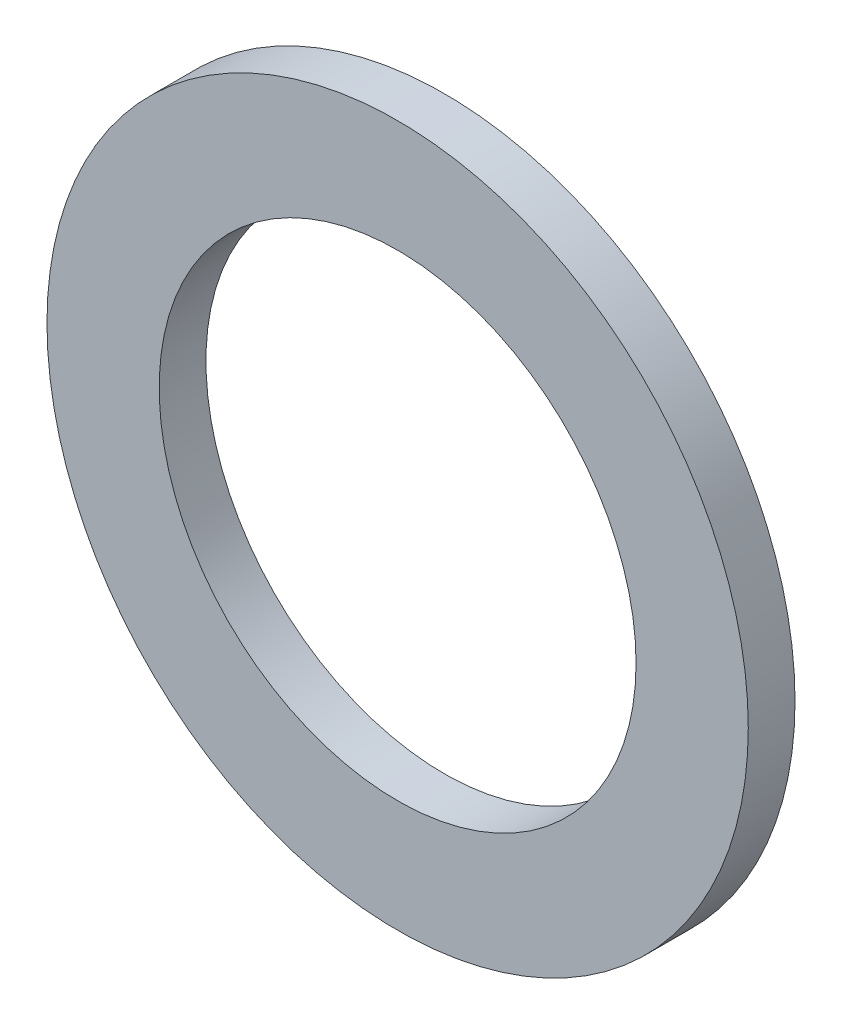
ISO-10303-21;
HEADER;
FILE_DESCRIPTION(('STEP AP214'),'2;1');
FILE_NAME('part.step','',(''),(''),'','','');
FILE_SCHEMA(('AUTOMOTIVE_DESIGN { 1 0 10303 214 1 1 1 1 }'));
ENDSEC;
DATA;
#1=APPLICATION_CONTEXT('core data for automotive mechanical design processes');
#2=APPLICATION_PROTOCOL_DEFINITION('international standard','automotive_design',2000,#1);
#3=PRODUCT_CONTEXT('',#1,'mechanical');
#4=PRODUCT('Part','Part','',(#3));
#5=PRODUCT_RELATED_PRODUCT_CATEGORY('part','',(#4));
#6=PRODUCT_DEFINITION_FORMATION('','',#4);
#7=PRODUCT_DEFINITION_CONTEXT('part definition',#1,'design');
#8=PRODUCT_DEFINITION('design','',#6,#7);
#9=PRODUCT_DEFINITION_SHAPE('','',#8);
#10=(LENGTH_UNIT() NAMED_UNIT(*) SI_UNIT(.MILLI.,.METRE.));
#11=(NAMED_UNIT(*) PLANE_ANGLE_UNIT() SI_UNIT($,.RADIAN.));
#12=(NAMED_UNIT(*) SI_UNIT($,.STERADIAN.) SOLID_ANGLE_UNIT());
#13=UNCERTAINTY_MEASURE_WITH_UNIT(LENGTH_MEASURE(1.E-05),#10,'distance_accuracy_value','');
#14=(GEOMETRIC_REPRESENTATION_CONTEXT(3) GLOBAL_UNCERTAINTY_ASSIGNED_CONTEXT((#13)) GLOBAL_UNIT_ASSIGNED_CONTEXT((#10,
#11,#12)) REPRESENTATION_CONTEXT('',''));
#15=CARTESIAN_POINT('',(0.,0.,0.));
#16=DIRECTION('',(0.,0.,1.));
#17=DIRECTION('',(1.,0.,0.));
#18=AXIS2_PLACEMENT_3D('',#15,#16,#17);
#19=CARTESIAN_POINT('',(0.,0.,1.));
#20=DIRECTION('',(0.,0.,1.));
#21=DIRECTION('',(1.,0.,0.));
#22=AXIS2_PLACEMENT_3D('',#19,#20,#21);
#23=PLANE('',#22);
#24=CARTESIAN_POINT('',(0.,0.,1.));
#25=DIRECTION('',(0.,0.,1.));
#26=DIRECTION('',(1.,0.,0.));
#27=AXIS2_PLACEMENT_3D('',#24,#25,#26);
#28=CIRCLE('',#27,7.5);
#29=CARTESIAN_POINT('',(7.5,0.,1.));
#30=VERTEX_POINT('',#29);
#31=EDGE_CURVE('E10',#30,#30,#28,.T.);
#32=ORIENTED_EDGE('',*,*,#31,.T.);
#33=EDGE_LOOP('',(#32));
#34=FACE_BOUND('',#33,.T.);
#35=CARTESIAN_POINT('',(0.,0.,1.));
#36=DIRECTION('',(0.,0.,1.));
#37=DIRECTION('',(1.,0.,0.));
#38=AXIS2_PLACEMENT_3D('',#35,#36,#37);
#39=CIRCLE('',#38,5.1);
#40=CARTESIAN_POINT('',(5.1,0.,1.));
#41=VERTEX_POINT('',#40);
#42=EDGE_CURVE('E42',#41,#41,#39,.T.);
#43=ORIENTED_EDGE('',*,*,#42,.F.);
#44=EDGE_LOOP('',(#43));
#45=FACE_BOUND('',#44,.T.);
#46=ADVANCED_FACE('F31',(#34,#45),#23,.T.);
#47=CARTESIAN_POINT('',(0.,0.,0.));
#48=DIRECTION('',(0.,0.,1.));
#49=DIRECTION('',(1.,0.,0.));
#50=AXIS2_PLACEMENT_3D('',#47,#48,#49);
#51=PLANE('',#50);
#52=CARTESIAN_POINT('',(0.,0.,0.));
#53=DIRECTION('',(0.,0.,1.));
#54=DIRECTION('',(1.,0.,0.));
#55=AXIS2_PLACEMENT_3D('',#52,#53,#54);
#56=CIRCLE('',#55,7.5);
#57=CARTESIAN_POINT('',(7.5,0.,0.));
#58=VERTEX_POINT('',#57);
#59=EDGE_CURVE('E35',#58,#58,#56,.T.);
#60=ORIENTED_EDGE('',*,*,#59,.F.);
#61=EDGE_LOOP('',(#60));
#62=FACE_BOUND('',#61,.T.);
#63=CARTESIAN_POINT('',(0.,0.,0.));
#64=DIRECTION('',(0.,0.,1.));
#65=DIRECTION('',(1.,0.,0.));
#66=AXIS2_PLACEMENT_3D('',#63,#64,#65);
#67=CIRCLE('',#66,5.1);
#68=CARTESIAN_POINT('',(5.1,0.,0.));
#69=VERTEX_POINT('',#68);
#70=EDGE_CURVE('E44',#69,#69,#67,.T.);
#71=ORIENTED_EDGE('',*,*,#70,.T.);
#72=EDGE_LOOP('',(#71));
#73=FACE_BOUND('',#72,.T.);
#74=ADVANCED_FACE('F54',(#62,#73),#51,.F.);
#75=CARTESIAN_POINT('',(0.,0.,1.));
#76=DIRECTION('',(0.,0.,-1.));
#77=DIRECTION('',(-1.,0.,0.));
#78=AXIS2_PLACEMENT_3D('',#75,#76,#77);
#79=CYLINDRICAL_SURFACE('',#78,7.5);
#80=ORIENTED_EDGE('',*,*,#31,.F.);
#81=EDGE_LOOP('',(#80));
#82=FACE_BOUND('',#81,.T.);
#83=ORIENTED_EDGE('',*,*,#59,.T.);
#84=EDGE_LOOP('',(#83));
#85=FACE_BOUND('',#84,.T.);
#86=ADVANCED_FACE('F33',(#82,#85),#79,.T.);
#87=CARTESIAN_POINT('',(0.,0.,1.));
#88=DIRECTION('',(0.,0.,-1.));
#89=DIRECTION('',(-1.,0.,0.));
#90=AXIS2_PLACEMENT_3D('',#87,#88,#89);
#91=CYLINDRICAL_SURFACE('',#90,5.1);
#92=ORIENTED_EDGE('',*,*,#42,.T.);
#93=EDGE_LOOP('',(#92));
#94=FACE_BOUND('',#93,.T.);
#95=ORIENTED_EDGE('',*,*,#70,.F.);
#96=EDGE_LOOP('',(#95));
#97=FACE_BOUND('',#96,.T.);
#98=ADVANCED_FACE('F50',(#94,#97),#91,.F.);
#99=CLOSED_SHELL('',(#46,#74,#86,#98));
#100=MANIFOLD_SOLID_BREP('B2',#99);
#101=ADVANCED_BREP_SHAPE_REPRESENTATION('',(#18,#100),#14);
#102=SHAPE_DEFINITION_REPRESENTATION(#9,#101);
ENDSEC;
END-ISO-10303-21;
